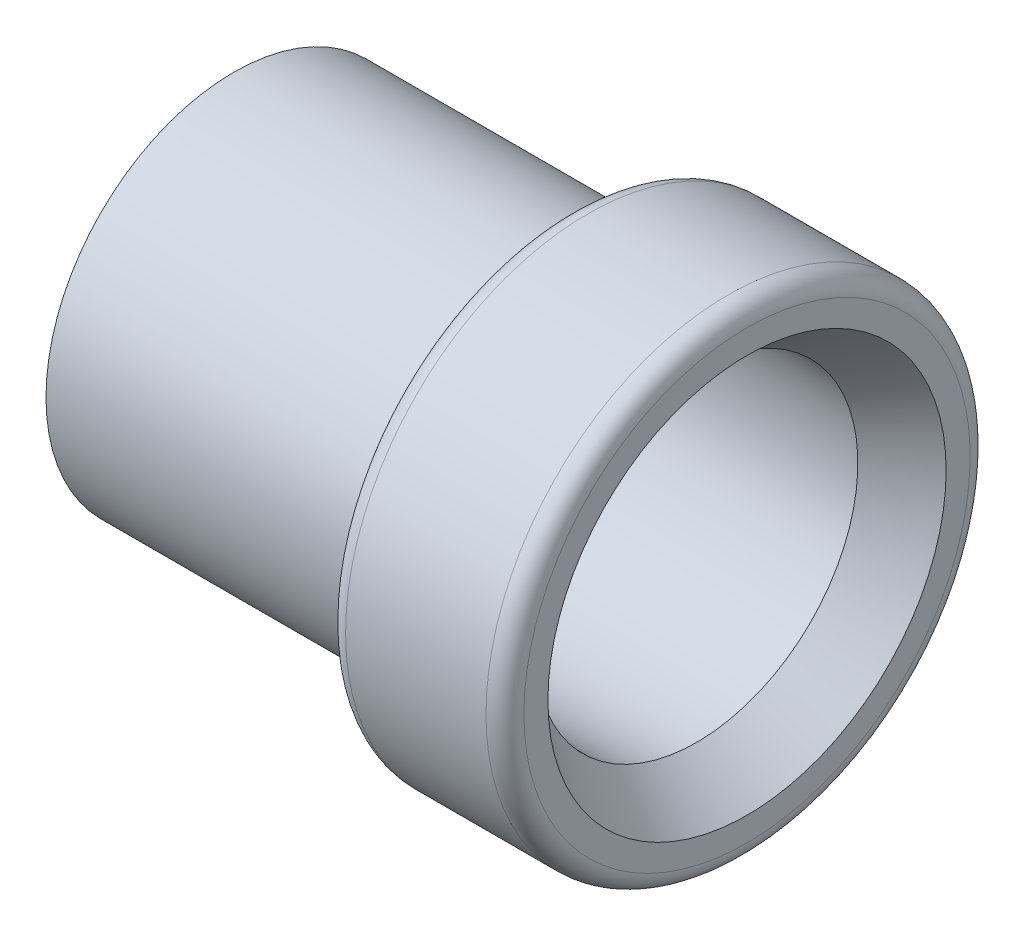
ISO-10303-21;
HEADER;
FILE_DESCRIPTION(('STEP AP214'),'2;1');
FILE_NAME('part.step','',(''),(''),'','','');
FILE_SCHEMA(('AUTOMOTIVE_DESIGN { 1 0 10303 214 1 1 1 1 }'));
ENDSEC;
DATA;
#1=APPLICATION_CONTEXT('core data for automotive mechanical design processes');
#2=APPLICATION_PROTOCOL_DEFINITION('international standard','automotive_design',2000,#1);
#3=PRODUCT_CONTEXT('',#1,'mechanical');
#4=PRODUCT('Part','Part','',(#3));
#5=PRODUCT_RELATED_PRODUCT_CATEGORY('part','',(#4));
#6=PRODUCT_DEFINITION_FORMATION('','',#4);
#7=PRODUCT_DEFINITION_CONTEXT('part definition',#1,'design');
#8=PRODUCT_DEFINITION('design','',#6,#7);
#9=PRODUCT_DEFINITION_SHAPE('','',#8);
#10=(LENGTH_UNIT() NAMED_UNIT(*) SI_UNIT(.MILLI.,.METRE.));
#11=(NAMED_UNIT(*) PLANE_ANGLE_UNIT() SI_UNIT($,.RADIAN.));
#12=(NAMED_UNIT(*) SI_UNIT($,.STERADIAN.) SOLID_ANGLE_UNIT());
#13=UNCERTAINTY_MEASURE_WITH_UNIT(LENGTH_MEASURE(1.E-05),#10,'distance_accuracy_value','');
#14=(GEOMETRIC_REPRESENTATION_CONTEXT(3) GLOBAL_UNCERTAINTY_ASSIGNED_CONTEXT((#13)) GLOBAL_UNIT_ASSIGNED_CONTEXT((#10,
#11,#12)) REPRESENTATION_CONTEXT('',''));
#15=CARTESIAN_POINT('',(0.,0.,0.));
#16=DIRECTION('',(0.,0.,1.));
#17=DIRECTION('',(1.,0.,0.));
#18=AXIS2_PLACEMENT_3D('',#15,#16,#17);
#19=CARTESIAN_POINT('',(-5.1562,3.2385,0.));
#20=DIRECTION('',(1.,0.,0.));
#21=DIRECTION('',(0.,0.,-1.));
#22=AXIS2_PLACEMENT_3D('',#19,#20,#21);
#23=PLANE('',#22);
#24=CARTESIAN_POINT('',(-5.1562,0.,0.));
#25=DIRECTION('',(-1.,0.,0.));
#26=DIRECTION('',(0.,0.,1.));
#27=AXIS2_PLACEMENT_3D('',#24,#25,#26);
#28=CIRCLE('',#27,3.2385);
#29=CARTESIAN_POINT('',(-5.1562,0.,3.2385));
#30=VERTEX_POINT('',#29);
#31=EDGE_CURVE('E10',#30,#30,#28,.T.);
#32=ORIENTED_EDGE('',*,*,#31,.F.);
#33=EDGE_LOOP('',(#32));
#34=FACE_BOUND('',#33,.T.);
#35=CARTESIAN_POINT('',(-5.1562,0.,0.));
#36=DIRECTION('',(-1.,0.,0.));
#37=DIRECTION('',(0.,0.,1.));
#38=AXIS2_PLACEMENT_3D('',#35,#36,#37);
#39=CIRCLE('',#38,3.7719);
#40=CARTESIAN_POINT('',(-5.1562,0.,3.7719));
#41=VERTEX_POINT('',#40);
#42=EDGE_CURVE('E66',#41,#41,#39,.T.);
#43=ORIENTED_EDGE('',*,*,#42,.T.);
#44=EDGE_LOOP('',(#43));
#45=FACE_BOUND('',#44,.T.);
#46=ADVANCED_FACE('F35',(#34,#45),#23,.F.);
#47=CARTESIAN_POINT('',(-5.1562,0.,0.));
#48=DIRECTION('',(-1.,0.,0.));
#49=DIRECTION('',(0.,0.,1.));
#50=AXIS2_PLACEMENT_3D('',#47,#48,#49);
#51=CYLINDRICAL_SURFACE('',#50,3.2385);
#52=CARTESIAN_POINT('',(4.14499184592525,0.,0.));
#53=DIRECTION('',(-1.,0.,0.));
#54=DIRECTION('',(0.,0.,1.));
#55=AXIS2_PLACEMENT_3D('',#52,#53,#54);
#56=CIRCLE('',#55,3.2385);
#57=CARTESIAN_POINT('',(4.14499184592525,0.,3.2385));
#58=VERTEX_POINT('',#57);
#59=EDGE_CURVE('E41',#58,#58,#56,.T.);
#60=ORIENTED_EDGE('',*,*,#59,.F.);
#61=EDGE_LOOP('',(#60));
#62=FACE_BOUND('',#61,.T.);
#63=ORIENTED_EDGE('',*,*,#31,.T.);
#64=EDGE_LOOP('',(#63));
#65=FACE_BOUND('',#64,.T.);
#66=ADVANCED_FACE('F109',(#62,#65),#51,.F.);
#67=CARTESIAN_POINT('',(4.14499184592525,0.,0.));
#68=DIRECTION('',(1.,0.,0.));
#69=DIRECTION('',(0.,0.,-1.));
#70=AXIS2_PLACEMENT_3D('',#67,#68,#69);
#71=CONICAL_SURFACE('',#70,3.2385,0.645771823237903);
#72=CARTESIAN_POINT('',(5.1562,0.,0.));
#73=DIRECTION('',(-1.,0.,0.));
#74=DIRECTION('',(0.,0.,1.));
#75=AXIS2_PLACEMENT_3D('',#72,#73,#74);
#76=CIRCLE('',#75,4.0005);
#77=CARTESIAN_POINT('',(5.1562,0.,4.0005));
#78=VERTEX_POINT('',#77);
#79=EDGE_CURVE('E45',#78,#78,#76,.T.);
#80=ORIENTED_EDGE('',*,*,#79,.F.);
#81=EDGE_LOOP('',(#80));
#82=FACE_BOUND('',#81,.T.);
#83=ORIENTED_EDGE('',*,*,#59,.T.);
#84=EDGE_LOOP('',(#83));
#85=FACE_BOUND('',#84,.T.);
#86=ADVANCED_FACE('F104',(#82,#85),#71,.F.);
#87=CARTESIAN_POINT('',(5.1562,4.0005,0.));
#88=DIRECTION('',(-1.,0.,0.));
#89=DIRECTION('',(0.,0.,1.));
#90=AXIS2_PLACEMENT_3D('',#87,#88,#89);
#91=PLANE('',#90);
#92=CARTESIAN_POINT('',(5.1562,0.,0.));
#93=DIRECTION('',(-1.,0.,0.));
#94=DIRECTION('',(0.,0.,1.));
#95=AXIS2_PLACEMENT_3D('',#92,#93,#94);
#96=CIRCLE('',#95,4.4831);
#97=CARTESIAN_POINT('',(5.1562,0.,4.4831));
#98=VERTEX_POINT('',#97);
#99=EDGE_CURVE('E49',#98,#98,#96,.T.);
#100=ORIENTED_EDGE('',*,*,#99,.F.);
#101=EDGE_LOOP('',(#100));
#102=FACE_BOUND('',#101,.T.);
#103=ORIENTED_EDGE('',*,*,#79,.T.);
#104=EDGE_LOOP('',(#103));
#105=FACE_BOUND('',#104,.T.);
#106=ADVANCED_FACE('F98',(#102,#105),#91,.F.);
#107=CARTESIAN_POINT('',(4.7752,0.,0.));
#108=DIRECTION('',(-1.,0.,0.));
#109=DIRECTION('',(0.,0.,1.));
#110=AXIS2_PLACEMENT_3D('',#107,#108,#109);
#111=TOROIDAL_SURFACE('',#110,4.4831,0.381000000000002);
#112=CARTESIAN_POINT('',(4.7752,0.,0.));
#113=DIRECTION('',(-1.,0.,0.));
#114=DIRECTION('',(0.,0.,1.));
#115=AXIS2_PLACEMENT_3D('',#112,#113,#114);
#116=CIRCLE('',#115,4.8641);
#117=CARTESIAN_POINT('',(4.7752,0.,4.8641));
#118=VERTEX_POINT('',#117);
#119=EDGE_CURVE('E54',#118,#118,#116,.T.);
#120=ORIENTED_EDGE('',*,*,#119,.F.);
#121=EDGE_LOOP('',(#120));
#122=FACE_BOUND('',#121,.T.);
#123=ORIENTED_EDGE('',*,*,#99,.T.);
#124=EDGE_LOOP('',(#123));
#125=FACE_BOUND('',#124,.T.);
#126=ADVANCED_FACE('F92',(#122,#125),#111,.T.);
#127=CARTESIAN_POINT('',(-5.1562,0.,0.));
#128=DIRECTION('',(-1.,0.,0.));
#129=DIRECTION('',(0.,0.,1.));
#130=AXIS2_PLACEMENT_3D('',#127,#128,#129);
#131=CYLINDRICAL_SURFACE('',#130,4.8641);
#132=CARTESIAN_POINT('',(1.9558,0.,0.));
#133=DIRECTION('',(-1.,0.,0.));
#134=DIRECTION('',(0.,0.,1.));
#135=AXIS2_PLACEMENT_3D('',#132,#133,#134);
#136=CIRCLE('',#135,4.8641);
#137=CARTESIAN_POINT('',(1.9558,0.,4.8641));
#138=VERTEX_POINT('',#137);
#139=EDGE_CURVE('E57',#138,#138,#136,.T.);
#140=ORIENTED_EDGE('',*,*,#139,.F.);
#141=EDGE_LOOP('',(#140));
#142=FACE_BOUND('',#141,.T.);
#143=ORIENTED_EDGE('',*,*,#119,.T.);
#144=EDGE_LOOP('',(#143));
#145=FACE_BOUND('',#144,.T.);
#146=ADVANCED_FACE('F86',(#142,#145),#131,.T.);
#147=CARTESIAN_POINT('',(1.9558,0.,0.));
#148=DIRECTION('',(-1.,0.,0.));
#149=DIRECTION('',(0.,0.,1.));
#150=AXIS2_PLACEMENT_3D('',#147,#148,#149);
#151=TOROIDAL_SURFACE('',#150,4.4831,0.381);
#152=CARTESIAN_POINT('',(1.5748,0.,0.));
#153=DIRECTION('',(-1.,0.,0.));
#154=DIRECTION('',(0.,0.,1.));
#155=AXIS2_PLACEMENT_3D('',#152,#153,#154);
#156=CIRCLE('',#155,4.4831);
#157=CARTESIAN_POINT('',(1.5748,0.,4.4831));
#158=VERTEX_POINT('',#157);
#159=EDGE_CURVE('E60',#158,#158,#156,.T.);
#160=ORIENTED_EDGE('',*,*,#159,.F.);
#161=EDGE_LOOP('',(#160));
#162=FACE_BOUND('',#161,.T.);
#163=ORIENTED_EDGE('',*,*,#139,.T.);
#164=EDGE_LOOP('',(#163));
#165=FACE_BOUND('',#164,.T.);
#166=ADVANCED_FACE('F80',(#162,#165),#151,.T.);
#167=CARTESIAN_POINT('',(1.5748,4.4831,0.));
#168=DIRECTION('',(1.,0.,0.));
#169=DIRECTION('',(0.,0.,-1.));
#170=AXIS2_PLACEMENT_3D('',#167,#168,#169);
#171=PLANE('',#170);
#172=CARTESIAN_POINT('',(1.5748,0.,0.));
#173=DIRECTION('',(-1.,0.,0.));
#174=DIRECTION('',(0.,0.,1.));
#175=AXIS2_PLACEMENT_3D('',#172,#173,#174);
#176=CIRCLE('',#175,3.7719);
#177=CARTESIAN_POINT('',(1.5748,0.,3.7719));
#178=VERTEX_POINT('',#177);
#179=EDGE_CURVE('E63',#178,#178,#176,.T.);
#180=ORIENTED_EDGE('',*,*,#179,.F.);
#181=EDGE_LOOP('',(#180));
#182=FACE_BOUND('',#181,.T.);
#183=ORIENTED_EDGE('',*,*,#159,.T.);
#184=EDGE_LOOP('',(#183));
#185=FACE_BOUND('',#184,.T.);
#186=ADVANCED_FACE('F74',(#182,#185),#171,.F.);
#187=CARTESIAN_POINT('',(-5.1562,0.,0.));
#188=DIRECTION('',(-1.,0.,0.));
#189=DIRECTION('',(0.,0.,1.));
#190=AXIS2_PLACEMENT_3D('',#187,#188,#189);
#191=CYLINDRICAL_SURFACE('',#190,3.7719);
#192=ORIENTED_EDGE('',*,*,#42,.F.);
#193=EDGE_LOOP('',(#192));
#194=FACE_BOUND('',#193,.T.);
#195=ORIENTED_EDGE('',*,*,#179,.T.);
#196=EDGE_LOOP('',(#195));
#197=FACE_BOUND('',#196,.T.);
#198=ADVANCED_FACE('F71',(#194,#197),#191,.T.);
#199=CLOSED_SHELL('',(#46,#66,#86,#106,#126,#146,#166,#186,#198));
#200=MANIFOLD_SOLID_BREP('B2',#199);
#201=ADVANCED_BREP_SHAPE_REPRESENTATION('',(#18,#200),#14);
#202=SHAPE_DEFINITION_REPRESENTATION(#9,#201);
ENDSEC;
END-ISO-10303-21;
